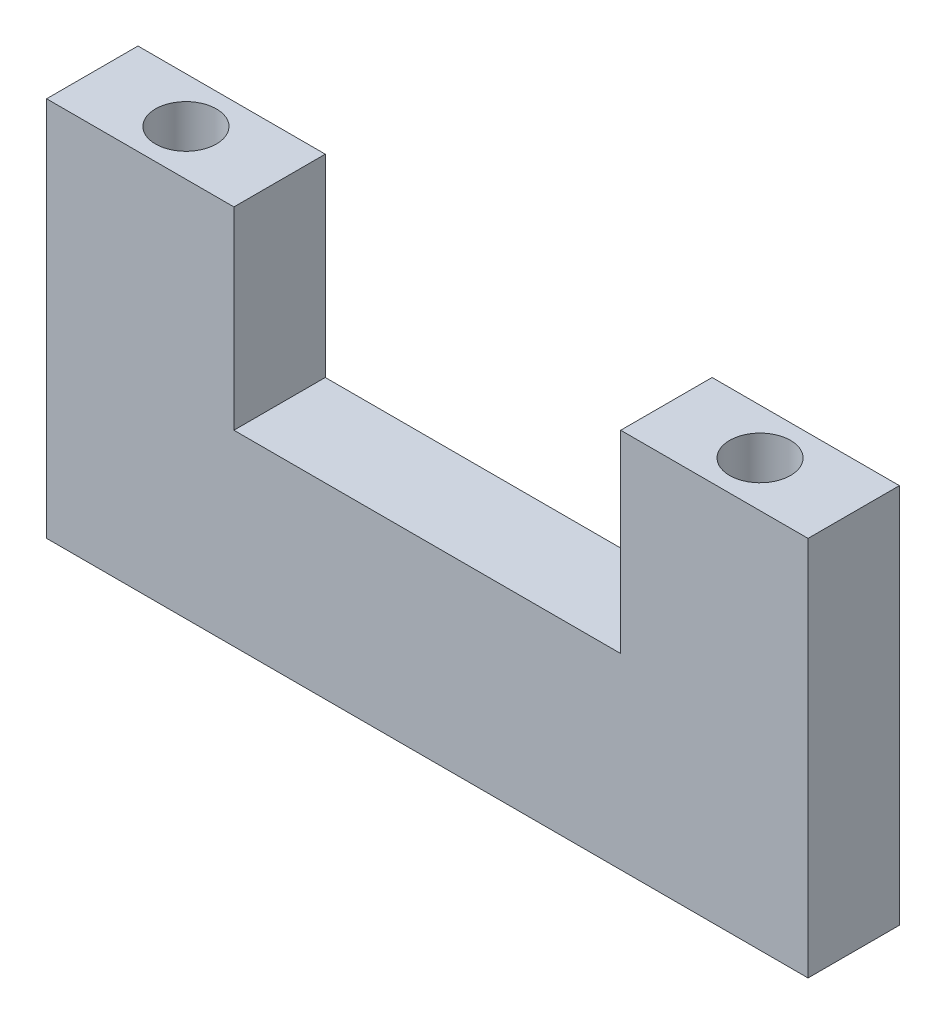
ISO-10303-21;
HEADER;
FILE_DESCRIPTION(('STEP AP214'),'2;1');
FILE_NAME('part.step','',(''),(''),'','','');
FILE_SCHEMA(('AUTOMOTIVE_DESIGN { 1 0 10303 214 1 1 1 1 }'));
ENDSEC;
DATA;
#1=APPLICATION_CONTEXT('core data for automotive mechanical design processes');
#2=APPLICATION_PROTOCOL_DEFINITION('international standard','automotive_design',2000,#1);
#3=PRODUCT_CONTEXT('',#1,'mechanical');
#4=PRODUCT('Part','Part','',(#3));
#5=PRODUCT_RELATED_PRODUCT_CATEGORY('part','',(#4));
#6=PRODUCT_DEFINITION_FORMATION('','',#4);
#7=PRODUCT_DEFINITION_CONTEXT('part definition',#1,'design');
#8=PRODUCT_DEFINITION('design','',#6,#7);
#9=PRODUCT_DEFINITION_SHAPE('','',#8);
#10=(LENGTH_UNIT() NAMED_UNIT(*) SI_UNIT(.MILLI.,.METRE.));
#11=(NAMED_UNIT(*) PLANE_ANGLE_UNIT() SI_UNIT($,.RADIAN.));
#12=(NAMED_UNIT(*) SI_UNIT($,.STERADIAN.) SOLID_ANGLE_UNIT());
#13=UNCERTAINTY_MEASURE_WITH_UNIT(LENGTH_MEASURE(1.E-05),#10,'distance_accuracy_value','');
#14=(GEOMETRIC_REPRESENTATION_CONTEXT(3) GLOBAL_UNCERTAINTY_ASSIGNED_CONTEXT((#13)) GLOBAL_UNIT_ASSIGNED_CONTEXT((#10,
#11,#12)) REPRESENTATION_CONTEXT('',''));
#15=CARTESIAN_POINT('',(0.,0.,0.));
#16=DIRECTION('',(0.,0.,1.));
#17=DIRECTION('',(1.,0.,0.));
#18=AXIS2_PLACEMENT_3D('',#15,#16,#17);
#19=CARTESIAN_POINT('',(-12.5,6.25,3.));
#20=DIRECTION('',(0.,-1.,0.));
#21=DIRECTION('',(0.,0.,-1.));
#22=AXIS2_PLACEMENT_3D('',#19,#20,#21);
#23=PLANE('',#22);
#24=CARTESIAN_POINT('',(-9.425,6.25,1.5));
#25=DIRECTION('',(0.,1.,0.));
#26=DIRECTION('',(0.,0.,1.));
#27=AXIS2_PLACEMENT_3D('',#24,#25,#26);
#28=CIRCLE('',#27,1.);
#29=CARTESIAN_POINT('',(-9.425,6.25,2.5));
#30=VERTEX_POINT('',#29);
#31=EDGE_CURVE('E145',#30,#30,#28,.T.);
#32=ORIENTED_EDGE('',*,*,#31,.F.);
#33=EDGE_LOOP('',(#32));
#34=FACE_BOUND('',#33,.T.);
#35=DIRECTION('',(-1.,0.,0.));
#36=VECTOR('',#35,1.);
#37=CARTESIAN_POINT('',(-12.5,6.25,3.));
#38=LINE('',#37,#36);
#39=CARTESIAN_POINT('',(-6.35,6.25,3.));
#40=VERTEX_POINT('',#39);
#41=CARTESIAN_POINT('',(-12.5,6.25,3.));
#42=VERTEX_POINT('',#41);
#43=EDGE_CURVE('E167',#40,#42,#38,.T.);
#44=ORIENTED_EDGE('',*,*,#43,.F.);
#45=DIRECTION('',(0.,0.,1.));
#46=VECTOR('',#45,1.);
#47=CARTESIAN_POINT('',(-6.35,6.25,0.));
#48=LINE('',#47,#46);
#49=CARTESIAN_POINT('',(-6.35,6.25,0.));
#50=VERTEX_POINT('',#49);
#51=EDGE_CURVE('E155',#50,#40,#48,.T.);
#52=ORIENTED_EDGE('',*,*,#51,.F.);
#53=DIRECTION('',(-1.,0.,0.));
#54=VECTOR('',#53,1.);
#55=CARTESIAN_POINT('',(-12.5,6.25,0.));
#56=LINE('',#55,#54);
#57=CARTESIAN_POINT('',(-12.5,6.25,0.));
#58=VERTEX_POINT('',#57);
#59=EDGE_CURVE('E137',#50,#58,#56,.T.);
#60=ORIENTED_EDGE('',*,*,#59,.T.);
#61=DIRECTION('',(0.,0.,-1.));
#62=VECTOR('',#61,1.);
#63=CARTESIAN_POINT('',(-12.5,6.25,3.));
#64=LINE('',#63,#62);
#65=EDGE_CURVE('E48',#42,#58,#64,.T.);
#66=ORIENTED_EDGE('',*,*,#65,.F.);
#67=EDGE_LOOP('',(#44,#52,#60,#66));
#68=FACE_BOUND('',#67,.T.);
#69=ADVANCED_FACE('F39',(#34,#68),#23,.F.);
#70=CARTESIAN_POINT('',(12.5,6.25,3.));
#71=DIRECTION('',(-1.,0.,0.));
#72=DIRECTION('',(0.,0.,1.));
#73=AXIS2_PLACEMENT_3D('',#70,#71,#72);
#74=PLANE('',#73);
#75=DIRECTION('',(0.,1.,0.));
#76=VECTOR('',#75,1.);
#77=CARTESIAN_POINT('',(12.5,6.25,0.));
#78=LINE('',#77,#76);
#79=CARTESIAN_POINT('',(12.5,-6.25,0.));
#80=VERTEX_POINT('',#79);
#81=CARTESIAN_POINT('',(12.5,6.25,0.));
#82=VERTEX_POINT('',#81);
#83=EDGE_CURVE('E158',#80,#82,#78,.T.);
#84=ORIENTED_EDGE('',*,*,#83,.T.);
#85=DIRECTION('',(0.,0.,-1.));
#86=VECTOR('',#85,1.);
#87=CARTESIAN_POINT('',(12.5,6.25,3.));
#88=LINE('',#87,#86);
#89=CARTESIAN_POINT('',(12.5,6.25,3.));
#90=VERTEX_POINT('',#89);
#91=EDGE_CURVE('E11',#90,#82,#88,.T.);
#92=ORIENTED_EDGE('',*,*,#91,.F.);
#93=DIRECTION('',(0.,1.,0.));
#94=VECTOR('',#93,1.);
#95=CARTESIAN_POINT('',(12.5,6.25,3.));
#96=LINE('',#95,#94);
#97=CARTESIAN_POINT('',(12.5,-6.25,3.));
#98=VERTEX_POINT('',#97);
#99=EDGE_CURVE('E164',#98,#90,#96,.T.);
#100=ORIENTED_EDGE('',*,*,#99,.F.);
#101=DIRECTION('',(0.,0.,-1.));
#102=VECTOR('',#101,1.);
#103=CARTESIAN_POINT('',(12.5,-6.25,3.));
#104=LINE('',#103,#102);
#105=EDGE_CURVE('E175',#98,#80,#104,.T.);
#106=ORIENTED_EDGE('',*,*,#105,.T.);
#107=EDGE_LOOP('',(#84,#92,#100,#106));
#108=FACE_BOUND('',#107,.T.);
#109=ADVANCED_FACE('F41',(#108),#74,.F.);
#110=CARTESIAN_POINT('',(9.425,6.25,1.5));
#111=DIRECTION('',(0.,1.,0.));
#112=DIRECTION('',(0.,0.,1.));
#113=AXIS2_PLACEMENT_3D('',#110,#111,#112);
#114=CIRCLE('',#113,1.);
#115=CARTESIAN_POINT('',(9.425,6.25,2.5));
#116=VERTEX_POINT('',#115);
#117=EDGE_CURVE('E229',#116,#116,#114,.T.);
#118=ORIENTED_EDGE('',*,*,#117,.F.);
#119=EDGE_LOOP('',(#118));
#120=FACE_BOUND('',#119,.T.);
#121=CARTESIAN_POINT('',(6.35,6.25,0.));
#122=VERTEX_POINT('',#121);
#123=EDGE_CURVE('E179',#82,#122,#56,.T.);
#124=ORIENTED_EDGE('',*,*,#123,.T.);
#125=DIRECTION('',(0.,0.,1.));
#126=VECTOR('',#125,1.);
#127=CARTESIAN_POINT('',(6.35,6.25,0.));
#128=LINE('',#127,#126);
#129=CARTESIAN_POINT('',(6.35,6.25,3.));
#130=VERTEX_POINT('',#129);
#131=EDGE_CURVE('E159',#122,#130,#128,.T.);
#132=ORIENTED_EDGE('',*,*,#131,.T.);
#133=EDGE_CURVE('E92',#90,#130,#38,.T.);
#134=ORIENTED_EDGE('',*,*,#133,.F.);
#135=ORIENTED_EDGE('',*,*,#91,.T.);
#136=EDGE_LOOP('',(#124,#132,#134,#135));
#137=FACE_BOUND('',#136,.T.);
#138=ADVANCED_FACE('F214',(#120,#137),#23,.F.);
#139=CARTESIAN_POINT('',(-12.5,6.25,3.));
#140=DIRECTION('',(1.,0.,0.));
#141=DIRECTION('',(0.,1.,0.));
#142=AXIS2_PLACEMENT_3D('',#139,#140,#141);
#143=PLANE('',#142);
#144=DIRECTION('',(0.,-1.,0.));
#145=VECTOR('',#144,1.);
#146=CARTESIAN_POINT('',(-12.5,6.25,0.));
#147=LINE('',#146,#145);
#148=CARTESIAN_POINT('',(-12.5,-6.25,0.));
#149=VERTEX_POINT('',#148);
#150=EDGE_CURVE('E183',#58,#149,#147,.T.);
#151=ORIENTED_EDGE('',*,*,#150,.T.);
#152=DIRECTION('',(0.,0.,-1.));
#153=VECTOR('',#152,1.);
#154=CARTESIAN_POINT('',(-12.5,-6.25,3.));
#155=LINE('',#154,#153);
#156=CARTESIAN_POINT('',(-12.5,-6.25,3.));
#157=VERTEX_POINT('',#156);
#158=EDGE_CURVE('E190',#157,#149,#155,.T.);
#159=ORIENTED_EDGE('',*,*,#158,.F.);
#160=DIRECTION('',(0.,-1.,0.));
#161=VECTOR('',#160,1.);
#162=CARTESIAN_POINT('',(-12.5,6.25,3.));
#163=LINE('',#162,#161);
#164=EDGE_CURVE('E170',#42,#157,#163,.T.);
#165=ORIENTED_EDGE('',*,*,#164,.F.);
#166=ORIENTED_EDGE('',*,*,#65,.T.);
#167=EDGE_LOOP('',(#151,#159,#165,#166));
#168=FACE_BOUND('',#167,.T.);
#169=ADVANCED_FACE('F197',(#168),#143,.F.);
#170=CARTESIAN_POINT('',(-12.5,-6.25,3.));
#171=DIRECTION('',(0.,1.,0.));
#172=DIRECTION('',(0.,0.,1.));
#173=AXIS2_PLACEMENT_3D('',#170,#171,#172);
#174=PLANE('',#173);
#175=DIRECTION('',(1.,0.,0.));
#176=VECTOR('',#175,1.);
#177=CARTESIAN_POINT('',(-12.5,-6.25,0.));
#178=LINE('',#177,#176);
#179=EDGE_CURVE('E85',#149,#80,#178,.T.);
#180=ORIENTED_EDGE('',*,*,#179,.T.);
#181=ORIENTED_EDGE('',*,*,#105,.F.);
#182=DIRECTION('',(1.,0.,0.));
#183=VECTOR('',#182,1.);
#184=CARTESIAN_POINT('',(-12.5,-6.25,3.));
#185=LINE('',#184,#183);
#186=EDGE_CURVE('E64',#157,#98,#185,.T.);
#187=ORIENTED_EDGE('',*,*,#186,.F.);
#188=ORIENTED_EDGE('',*,*,#158,.T.);
#189=EDGE_LOOP('',(#180,#181,#187,#188));
#190=FACE_BOUND('',#189,.T.);
#191=ADVANCED_FACE('F205',(#190),#174,.F.);
#192=CARTESIAN_POINT('',(0.,0.,3.));
#193=DIRECTION('',(0.,0.,1.));
#194=DIRECTION('',(1.,0.,0.));
#195=AXIS2_PLACEMENT_3D('',#192,#193,#194);
#196=PLANE('',#195);
#197=DIRECTION('',(0.,-1.,0.));
#198=VECTOR('',#197,1.);
#199=CARTESIAN_POINT('',(-6.35,6.25,3.));
#200=LINE('',#199,#198);
#201=CARTESIAN_POINT('',(-6.35,-0.0999999999999985,3.));
#202=VERTEX_POINT('',#201);
#203=EDGE_CURVE('E121',#40,#202,#200,.T.);
#204=ORIENTED_EDGE('',*,*,#203,.F.);
#205=ORIENTED_EDGE('',*,*,#43,.T.);
#206=ORIENTED_EDGE('',*,*,#164,.T.);
#207=ORIENTED_EDGE('',*,*,#186,.T.);
#208=ORIENTED_EDGE('',*,*,#99,.T.);
#209=ORIENTED_EDGE('',*,*,#133,.T.);
#210=DIRECTION('',(0.,1.,0.));
#211=VECTOR('',#210,1.);
#212=CARTESIAN_POINT('',(6.35,6.25,3.));
#213=LINE('',#212,#211);
#214=CARTESIAN_POINT('',(6.35,-0.0999999999999985,3.));
#215=VERTEX_POINT('',#214);
#216=EDGE_CURVE('E139',#215,#130,#213,.T.);
#217=ORIENTED_EDGE('',*,*,#216,.F.);
#218=DIRECTION('',(1.,0.,0.));
#219=VECTOR('',#218,1.);
#220=CARTESIAN_POINT('',(-6.35,-0.0999999999999985,3.));
#221=LINE('',#220,#219);
#222=EDGE_CURVE('E142',#202,#215,#221,.T.);
#223=ORIENTED_EDGE('',*,*,#222,.F.);
#224=EDGE_LOOP('',(#204,#205,#206,#207,#208,#209,#217,#223));
#225=FACE_BOUND('',#224,.T.);
#226=ADVANCED_FACE('F207',(#225),#196,.T.);
#227=CARTESIAN_POINT('',(0.,0.,0.));
#228=DIRECTION('',(0.,0.,1.));
#229=DIRECTION('',(1.,0.,0.));
#230=AXIS2_PLACEMENT_3D('',#227,#228,#229);
#231=PLANE('',#230);
#232=ORIENTED_EDGE('',*,*,#59,.F.);
#233=DIRECTION('',(0.,-1.,0.));
#234=VECTOR('',#233,1.);
#235=CARTESIAN_POINT('',(-6.35,6.25,0.));
#236=LINE('',#235,#234);
#237=CARTESIAN_POINT('',(-6.35,-0.0999999999999985,0.));
#238=VERTEX_POINT('',#237);
#239=EDGE_CURVE('E118',#50,#238,#236,.T.);
#240=ORIENTED_EDGE('',*,*,#239,.T.);
#241=DIRECTION('',(1.,0.,0.));
#242=VECTOR('',#241,1.);
#243=CARTESIAN_POINT('',(-6.35,-0.0999999999999985,0.));
#244=LINE('',#243,#242);
#245=CARTESIAN_POINT('',(6.35,-0.0999999999999985,0.));
#246=VERTEX_POINT('',#245);
#247=EDGE_CURVE('E129',#238,#246,#244,.T.);
#248=ORIENTED_EDGE('',*,*,#247,.T.);
#249=DIRECTION('',(0.,1.,0.));
#250=VECTOR('',#249,1.);
#251=CARTESIAN_POINT('',(6.35,6.25,0.));
#252=LINE('',#251,#250);
#253=EDGE_CURVE('E55',#246,#122,#252,.T.);
#254=ORIENTED_EDGE('',*,*,#253,.T.);
#255=ORIENTED_EDGE('',*,*,#123,.F.);
#256=ORIENTED_EDGE('',*,*,#83,.F.);
#257=ORIENTED_EDGE('',*,*,#179,.F.);
#258=ORIENTED_EDGE('',*,*,#150,.F.);
#259=EDGE_LOOP('',(#232,#240,#248,#254,#255,#256,#257,#258));
#260=FACE_BOUND('',#259,.T.);
#261=ADVANCED_FACE('F135',(#260),#231,.F.);
#262=CARTESIAN_POINT('',(-6.35,6.25,0.));
#263=DIRECTION('',(-1.,0.,0.));
#264=DIRECTION('',(0.,-1.,0.));
#265=AXIS2_PLACEMENT_3D('',#262,#263,#264);
#266=PLANE('',#265);
#267=ORIENTED_EDGE('',*,*,#203,.T.);
#268=DIRECTION('',(0.,0.,1.));
#269=VECTOR('',#268,1.);
#270=CARTESIAN_POINT('',(-6.35,-0.0999999999999985,0.));
#271=LINE('',#270,#269);
#272=EDGE_CURVE('E114',#238,#202,#271,.T.);
#273=ORIENTED_EDGE('',*,*,#272,.F.);
#274=ORIENTED_EDGE('',*,*,#239,.F.);
#275=ORIENTED_EDGE('',*,*,#51,.T.);
#276=EDGE_LOOP('',(#267,#273,#274,#275));
#277=FACE_BOUND('',#276,.T.);
#278=ADVANCED_FACE('F116',(#277),#266,.F.);
#279=CARTESIAN_POINT('',(6.35,6.25,0.));
#280=DIRECTION('',(1.,0.,0.));
#281=DIRECTION('',(0.,1.,0.));
#282=AXIS2_PLACEMENT_3D('',#279,#280,#281);
#283=PLANE('',#282);
#284=ORIENTED_EDGE('',*,*,#216,.T.);
#285=ORIENTED_EDGE('',*,*,#131,.F.);
#286=ORIENTED_EDGE('',*,*,#253,.F.);
#287=DIRECTION('',(0.,0.,1.));
#288=VECTOR('',#287,1.);
#289=CARTESIAN_POINT('',(6.35,-0.0999999999999985,0.));
#290=LINE('',#289,#288);
#291=EDGE_CURVE('E126',#246,#215,#290,.T.);
#292=ORIENTED_EDGE('',*,*,#291,.T.);
#293=EDGE_LOOP('',(#284,#285,#286,#292));
#294=FACE_BOUND('',#293,.T.);
#295=ADVANCED_FACE('F231',(#294),#283,.F.);
#296=CARTESIAN_POINT('',(-6.35,-0.0999999999999985,0.));
#297=DIRECTION('',(0.,-1.,0.));
#298=DIRECTION('',(0.,0.,-1.));
#299=AXIS2_PLACEMENT_3D('',#296,#297,#298);
#300=PLANE('',#299);
#301=ORIENTED_EDGE('',*,*,#222,.T.);
#302=ORIENTED_EDGE('',*,*,#291,.F.);
#303=ORIENTED_EDGE('',*,*,#247,.F.);
#304=ORIENTED_EDGE('',*,*,#272,.T.);
#305=EDGE_LOOP('',(#301,#302,#303,#304));
#306=FACE_BOUND('',#305,.T.);
#307=ADVANCED_FACE('F130',(#306),#300,.F.);
#308=CARTESIAN_POINT('',(-9.425,1.25,1.5));
#309=DIRECTION('',(0.,1.,0.));
#310=DIRECTION('',(0.,0.,1.));
#311=AXIS2_PLACEMENT_3D('',#308,#309,#310);
#312=CYLINDRICAL_SURFACE('',#311,1.);
#313=CARTESIAN_POINT('',(-9.425,1.25,1.5));
#314=DIRECTION('',(0.,1.,0.));
#315=DIRECTION('',(0.,0.,1.));
#316=AXIS2_PLACEMENT_3D('',#313,#314,#315);
#317=CIRCLE('',#316,1.);
#318=CARTESIAN_POINT('',(-9.425,1.25,2.5));
#319=VERTEX_POINT('',#318);
#320=EDGE_CURVE('E152',#319,#319,#317,.T.);
#321=ORIENTED_EDGE('',*,*,#320,.F.);
#322=EDGE_LOOP('',(#321));
#323=FACE_BOUND('',#322,.T.);
#324=ORIENTED_EDGE('',*,*,#31,.T.);
#325=EDGE_LOOP('',(#324));
#326=FACE_BOUND('',#325,.T.);
#327=ADVANCED_FACE('F238',(#323,#326),#312,.F.);
#328=CARTESIAN_POINT('',(-9.425,1.25,1.5));
#329=DIRECTION('',(0.,1.,0.));
#330=DIRECTION('',(0.,0.,1.));
#331=AXIS2_PLACEMENT_3D('',#328,#329,#330);
#332=PLANE('',#331);
#333=ORIENTED_EDGE('',*,*,#320,.T.);
#334=EDGE_LOOP('',(#333));
#335=FACE_BOUND('',#334,.T.);
#336=ADVANCED_FACE('F275',(#335),#332,.T.);
#337=CARTESIAN_POINT('',(9.425,1.25,1.5));
#338=DIRECTION('',(0.,1.,0.));
#339=DIRECTION('',(0.,0.,1.));
#340=AXIS2_PLACEMENT_3D('',#337,#338,#339);
#341=CYLINDRICAL_SURFACE('',#340,1.);
#342=CARTESIAN_POINT('',(9.425,1.25,1.5));
#343=DIRECTION('',(0.,1.,0.));
#344=DIRECTION('',(0.,0.,1.));
#345=AXIS2_PLACEMENT_3D('',#342,#343,#344);
#346=CIRCLE('',#345,1.);
#347=CARTESIAN_POINT('',(9.425,1.25,2.5));
#348=VERTEX_POINT('',#347);
#349=EDGE_CURVE('E315',#348,#348,#346,.T.);
#350=ORIENTED_EDGE('',*,*,#349,.F.);
#351=EDGE_LOOP('',(#350));
#352=FACE_BOUND('',#351,.T.);
#353=ORIENTED_EDGE('',*,*,#117,.T.);
#354=EDGE_LOOP('',(#353));
#355=FACE_BOUND('',#354,.T.);
#356=ADVANCED_FACE('F283',(#352,#355),#341,.F.);
#357=CARTESIAN_POINT('',(9.425,1.25,1.5));
#358=DIRECTION('',(0.,1.,0.));
#359=DIRECTION('',(0.,0.,1.));
#360=AXIS2_PLACEMENT_3D('',#357,#358,#359);
#361=PLANE('',#360);
#362=ORIENTED_EDGE('',*,*,#349,.T.);
#363=EDGE_LOOP('',(#362));
#364=FACE_BOUND('',#363,.T.);
#365=ADVANCED_FACE('F299',(#364),#361,.T.);
#366=CLOSED_SHELL('',(#69,#109,#138,#169,#191,#226,#261,#278,#295,#307,#327,#336,#356,#365));
#367=MANIFOLD_SOLID_BREP('B2',#366);
#368=ADVANCED_BREP_SHAPE_REPRESENTATION('',(#18,#367),#14);
#369=SHAPE_DEFINITION_REPRESENTATION(#9,#368);
ENDSEC;
END-ISO-10303-21;
